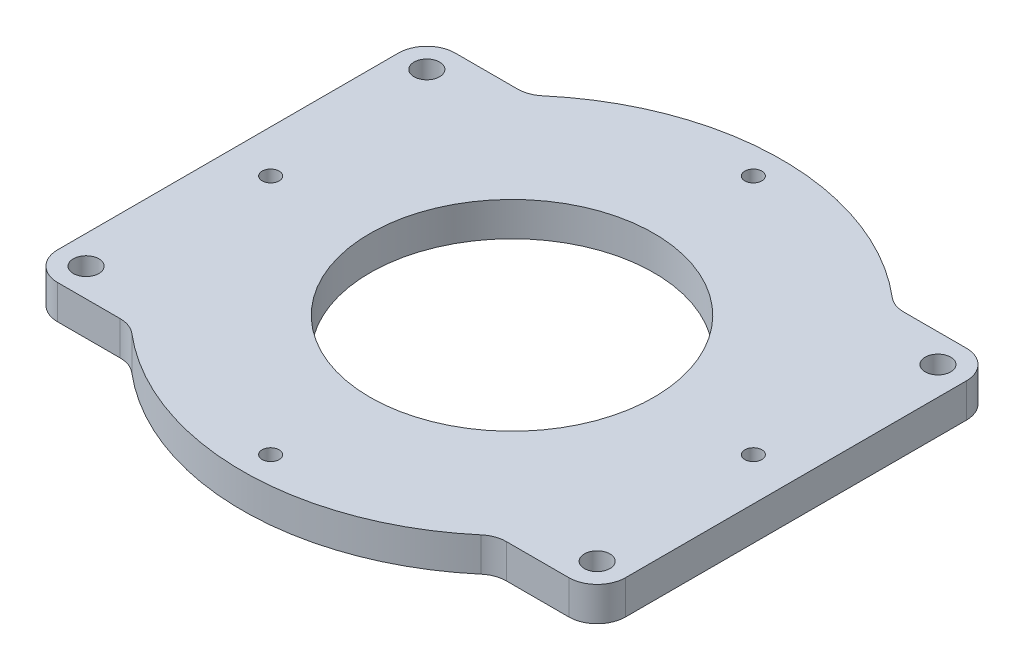
ISO-10303-21;
HEADER;
FILE_DESCRIPTION(('STEP AP214'),'2;1');
FILE_NAME('part.step','',(''),(''),'','','');
FILE_SCHEMA(('AUTOMOTIVE_DESIGN { 1 0 10303 214 1 1 1 1 }'));
ENDSEC;
DATA;
#1=APPLICATION_CONTEXT('core data for automotive mechanical design processes');
#2=APPLICATION_PROTOCOL_DEFINITION('international standard','automotive_design',2000,#1);
#3=PRODUCT_CONTEXT('',#1,'mechanical');
#4=PRODUCT('Part','Part','',(#3));
#5=PRODUCT_RELATED_PRODUCT_CATEGORY('part','',(#4));
#6=PRODUCT_DEFINITION_FORMATION('','',#4);
#7=PRODUCT_DEFINITION_CONTEXT('part definition',#1,'design');
#8=PRODUCT_DEFINITION('design','',#6,#7);
#9=PRODUCT_DEFINITION_SHAPE('','',#8);
#10=(LENGTH_UNIT() NAMED_UNIT(*) SI_UNIT(.MILLI.,.METRE.));
#11=(NAMED_UNIT(*) PLANE_ANGLE_UNIT() SI_UNIT($,.RADIAN.));
#12=(NAMED_UNIT(*) SI_UNIT($,.STERADIAN.) SOLID_ANGLE_UNIT());
#13=UNCERTAINTY_MEASURE_WITH_UNIT(LENGTH_MEASURE(1.E-05),#10,'distance_accuracy_value','');
#14=(GEOMETRIC_REPRESENTATION_CONTEXT(3) GLOBAL_UNCERTAINTY_ASSIGNED_CONTEXT((#13)) GLOBAL_UNIT_ASSIGNED_CONTEXT((#10,
#11,#12)) REPRESENTATION_CONTEXT('',''));
#15=CARTESIAN_POINT('',(0.,0.,0.));
#16=DIRECTION('',(0.,0.,1.));
#17=DIRECTION('',(1.,0.,0.));
#18=AXIS2_PLACEMENT_3D('',#15,#16,#17);
#19=CARTESIAN_POINT('',(-45.,6.,30.));
#20=DIRECTION('',(0.,1.,0.));
#21=DIRECTION('',(0.,0.,1.));
#22=AXIS2_PLACEMENT_3D('',#19,#20,#21);
#23=PLANE('',#22);
#24=CARTESIAN_POINT('',(0.,6.,42.5));
#25=DIRECTION('',(0.,1.,0.));
#26=DIRECTION('',(0.,0.,-1.));
#27=AXIS2_PLACEMENT_3D('',#24,#25,#26);
#28=CIRCLE('',#27,1.5);
#29=CARTESIAN_POINT('',(0.,6.,41.));
#30=VERTEX_POINT('',#29);
#31=EDGE_CURVE('E371',#30,#30,#28,.T.);
#32=ORIENTED_EDGE('',*,*,#31,.F.);
#33=EDGE_LOOP('',(#32));
#34=FACE_BOUND('',#33,.T.);
#35=CARTESIAN_POINT('',(0.,6.,-42.5));
#36=DIRECTION('',(0.,1.,0.));
#37=DIRECTION('',(0.,0.,1.));
#38=AXIS2_PLACEMENT_3D('',#35,#36,#37);
#39=CIRCLE('',#38,1.5);
#40=CARTESIAN_POINT('',(0.,6.,-41.));
#41=VERTEX_POINT('',#40);
#42=EDGE_CURVE('E383',#41,#41,#39,.T.);
#43=ORIENTED_EDGE('',*,*,#42,.F.);
#44=EDGE_LOOP('',(#43));
#45=FACE_BOUND('',#44,.T.);
#46=CARTESIAN_POINT('',(45.,6.,-30.));
#47=DIRECTION('',(0.,1.,0.));
#48=DIRECTION('',(0.,0.,1.));
#49=AXIS2_PLACEMENT_3D('',#46,#47,#48);
#50=CIRCLE('',#49,2.25);
#51=CARTESIAN_POINT('',(45.,6.,-27.75));
#52=VERTEX_POINT('',#51);
#53=EDGE_CURVE('E395',#52,#52,#50,.T.);
#54=ORIENTED_EDGE('',*,*,#53,.F.);
#55=EDGE_LOOP('',(#54));
#56=FACE_BOUND('',#55,.T.);
#57=CARTESIAN_POINT('',(-45.,6.,30.));
#58=DIRECTION('',(0.,1.,0.));
#59=DIRECTION('',(0.,0.,1.));
#60=AXIS2_PLACEMENT_3D('',#57,#58,#59);
#61=CIRCLE('',#60,2.25);
#62=CARTESIAN_POINT('',(-45.,6.,32.25));
#63=VERTEX_POINT('',#62);
#64=EDGE_CURVE('E407',#63,#63,#61,.T.);
#65=ORIENTED_EDGE('',*,*,#64,.F.);
#66=EDGE_LOOP('',(#65));
#67=FACE_BOUND('',#66,.T.);
#68=CARTESIAN_POINT('',(-45.,6.,30.));
#69=DIRECTION('',(0.,1.,0.));
#70=DIRECTION('',(0.,0.,1.));
#71=AXIS2_PLACEMENT_3D('',#68,#69,#70);
#72=CIRCLE('',#71,5.);
#73=CARTESIAN_POINT('',(-50.,6.,30.));
#74=VERTEX_POINT('',#73);
#75=CARTESIAN_POINT('',(-45.,6.,35.));
#76=VERTEX_POINT('',#75);
#77=EDGE_CURVE('E217',#74,#76,#72,.T.);
#78=ORIENTED_EDGE('',*,*,#77,.T.);
#79=DIRECTION('',(1.,0.,0.));
#80=VECTOR('',#79,1.);
#81=CARTESIAN_POINT('',(-45.,6.,35.));
#82=LINE('',#81,#80);
#83=CARTESIAN_POINT('',(-34.0036762718386,6.,35.));
#84=VERTEX_POINT('',#83);
#85=EDGE_CURVE('E125',#76,#84,#82,.T.);
#86=ORIENTED_EDGE('',*,*,#85,.T.);
#87=CARTESIAN_POINT('',(-34.0036762718386,6.,40.));
#88=DIRECTION('',(0.,-1.,0.));
#89=DIRECTION('',(0.,0.,1.));
#90=AXIS2_PLACEMENT_3D('',#87,#88,#89);
#91=CIRCLE('',#90,5.);
#92=CARTESIAN_POINT('',(-30.7652309126159,6.,36.1904761904762));
#93=VERTEX_POINT('',#92);
#94=EDGE_CURVE('E256',#84,#93,#91,.T.);
#95=ORIENTED_EDGE('',*,*,#94,.T.);
#96=CARTESIAN_POINT('',(0.,6.,0.));
#97=DIRECTION('',(0.,1.,0.));
#98=DIRECTION('',(0.,0.,-1.));
#99=AXIS2_PLACEMENT_3D('',#96,#97,#98);
#100=CIRCLE('',#99,47.5);
#101=CARTESIAN_POINT('',(30.7652309126159,6.,36.1904761904762));
#102=VERTEX_POINT('',#101);
#103=EDGE_CURVE('E275',#93,#102,#100,.T.);
#104=ORIENTED_EDGE('',*,*,#103,.T.);
#105=CARTESIAN_POINT('',(34.0036762718386,6.,40.));
#106=DIRECTION('',(0.,-1.,0.));
#107=DIRECTION('',(0.,0.,1.));
#108=AXIS2_PLACEMENT_3D('',#105,#106,#107);
#109=CIRCLE('',#108,5.);
#110=CARTESIAN_POINT('',(34.0036762718386,6.,35.));
#111=VERTEX_POINT('',#110);
#112=EDGE_CURVE('E272',#102,#111,#109,.T.);
#113=ORIENTED_EDGE('',*,*,#112,.T.);
#114=DIRECTION('',(1.,0.,0.));
#115=VECTOR('',#114,1.);
#116=CARTESIAN_POINT('',(34.0036762718386,6.,35.));
#117=LINE('',#116,#115);
#118=CARTESIAN_POINT('',(45.,6.,35.));
#119=VERTEX_POINT('',#118);
#120=EDGE_CURVE('E274',#111,#119,#117,.T.);
#121=ORIENTED_EDGE('',*,*,#120,.T.);
#122=CARTESIAN_POINT('',(45.,6.,30.));
#123=DIRECTION('',(0.,1.,0.));
#124=DIRECTION('',(0.,0.,1.));
#125=AXIS2_PLACEMENT_3D('',#122,#123,#124);
#126=CIRCLE('',#125,5.);
#127=CARTESIAN_POINT('',(50.,6.,30.));
#128=VERTEX_POINT('',#127);
#129=EDGE_CURVE('E277',#119,#128,#126,.T.);
#130=ORIENTED_EDGE('',*,*,#129,.T.);
#131=DIRECTION('',(0.,0.,-1.));
#132=VECTOR('',#131,1.);
#133=CARTESIAN_POINT('',(50.,6.,30.));
#134=LINE('',#133,#132);
#135=CARTESIAN_POINT('',(50.,6.,-30.));
#136=VERTEX_POINT('',#135);
#137=EDGE_CURVE('E283',#128,#136,#134,.T.);
#138=ORIENTED_EDGE('',*,*,#137,.T.);
#139=CARTESIAN_POINT('',(45.,6.,-30.));
#140=DIRECTION('',(0.,1.,0.));
#141=DIRECTION('',(0.,0.,1.));
#142=AXIS2_PLACEMENT_3D('',#139,#140,#141);
#143=CIRCLE('',#142,5.);
#144=CARTESIAN_POINT('',(45.,6.,-35.));
#145=VERTEX_POINT('',#144);
#146=EDGE_CURVE('E285',#136,#145,#143,.T.);
#147=ORIENTED_EDGE('',*,*,#146,.T.);
#148=DIRECTION('',(-1.,0.,0.));
#149=VECTOR('',#148,1.);
#150=CARTESIAN_POINT('',(34.0036762718386,6.,-35.));
#151=LINE('',#150,#149);
#152=CARTESIAN_POINT('',(34.0036762718386,6.,-35.));
#153=VERTEX_POINT('',#152);
#154=EDGE_CURVE('E287',#145,#153,#151,.T.);
#155=ORIENTED_EDGE('',*,*,#154,.T.);
#156=CARTESIAN_POINT('',(34.0036762718386,6.,-40.));
#157=DIRECTION('',(0.,-1.,0.));
#158=DIRECTION('',(0.,0.,-1.));
#159=AXIS2_PLACEMENT_3D('',#156,#157,#158);
#160=CIRCLE('',#159,5.);
#161=CARTESIAN_POINT('',(30.7652309126159,6.,-36.1904761904762));
#162=VERTEX_POINT('',#161);
#163=EDGE_CURVE('E289',#153,#162,#160,.T.);
#164=ORIENTED_EDGE('',*,*,#163,.T.);
#165=CARTESIAN_POINT('',(0.,6.,0.));
#166=DIRECTION('',(0.,1.,0.));
#167=DIRECTION('',(0.,0.,1.));
#168=AXIS2_PLACEMENT_3D('',#165,#166,#167);
#169=CIRCLE('',#168,47.5);
#170=CARTESIAN_POINT('',(-30.7652309126159,6.,-36.1904761904762));
#171=VERTEX_POINT('',#170);
#172=EDGE_CURVE('E291',#162,#171,#169,.T.);
#173=ORIENTED_EDGE('',*,*,#172,.T.);
#174=CARTESIAN_POINT('',(-34.0036762718386,6.,-40.));
#175=DIRECTION('',(0.,-1.,0.));
#176=DIRECTION('',(0.,0.,-1.));
#177=AXIS2_PLACEMENT_3D('',#174,#175,#176);
#178=CIRCLE('',#177,5.);
#179=CARTESIAN_POINT('',(-34.0036762718386,6.,-35.));
#180=VERTEX_POINT('',#179);
#181=EDGE_CURVE('E168',#171,#180,#178,.T.);
#182=ORIENTED_EDGE('',*,*,#181,.T.);
#183=DIRECTION('',(-1.,0.,0.));
#184=VECTOR('',#183,1.);
#185=CARTESIAN_POINT('',(-45.,6.,-35.));
#186=LINE('',#185,#184);
#187=CARTESIAN_POINT('',(-45.,6.,-35.));
#188=VERTEX_POINT('',#187);
#189=EDGE_CURVE('E162',#180,#188,#186,.T.);
#190=ORIENTED_EDGE('',*,*,#189,.T.);
#191=CARTESIAN_POINT('',(-45.,6.,-30.));
#192=DIRECTION('',(0.,1.,0.));
#193=DIRECTION('',(0.,0.,1.));
#194=AXIS2_PLACEMENT_3D('',#191,#192,#193);
#195=CIRCLE('',#194,5.);
#196=CARTESIAN_POINT('',(-50.,6.,-30.));
#197=VERTEX_POINT('',#196);
#198=EDGE_CURVE('E166',#188,#197,#195,.T.);
#199=ORIENTED_EDGE('',*,*,#198,.T.);
#200=DIRECTION('',(0.,0.,1.));
#201=VECTOR('',#200,1.);
#202=CARTESIAN_POINT('',(-50.,6.,30.));
#203=LINE('',#202,#201);
#204=EDGE_CURVE('E58',#197,#74,#203,.T.);
#205=ORIENTED_EDGE('',*,*,#204,.T.);
#206=EDGE_LOOP('',(#78,#86,#95,#104,#113,#121,#130,#138,#147,#155,#164,#173,#182,#190,#199,#205));
#207=FACE_BOUND('',#206,.T.);
#208=CARTESIAN_POINT('',(-45.,6.,-30.));
#209=DIRECTION('',(0.,1.,0.));
#210=DIRECTION('',(0.,0.,1.));
#211=AXIS2_PLACEMENT_3D('',#208,#209,#210);
#212=CIRCLE('',#211,2.25);
#213=CARTESIAN_POINT('',(-45.,6.,-27.75));
#214=VERTEX_POINT('',#213);
#215=EDGE_CURVE('E190',#214,#214,#212,.T.);
#216=ORIENTED_EDGE('',*,*,#215,.F.);
#217=EDGE_LOOP('',(#216));
#218=FACE_BOUND('',#217,.T.);
#219=CARTESIAN_POINT('',(45.,6.,30.));
#220=DIRECTION('',(0.,1.,0.));
#221=DIRECTION('',(0.,0.,1.));
#222=AXIS2_PLACEMENT_3D('',#219,#220,#221);
#223=CIRCLE('',#222,2.25000000000002);
#224=CARTESIAN_POINT('',(45.,6.,32.25));
#225=VERTEX_POINT('',#224);
#226=EDGE_CURVE('E401',#225,#225,#223,.T.);
#227=ORIENTED_EDGE('',*,*,#226,.F.);
#228=EDGE_LOOP('',(#227));
#229=FACE_BOUND('',#228,.T.);
#230=CARTESIAN_POINT('',(0.,6.,0.));
#231=DIRECTION('',(0.,1.,0.));
#232=DIRECTION('',(0.,0.,1.));
#233=AXIS2_PLACEMENT_3D('',#230,#231,#232);
#234=CIRCLE('',#233,25.);
#235=CARTESIAN_POINT('',(0.,6.,25.));
#236=VERTEX_POINT('',#235);
#237=EDGE_CURVE('E389',#236,#236,#234,.T.);
#238=ORIENTED_EDGE('',*,*,#237,.F.);
#239=EDGE_LOOP('',(#238));
#240=FACE_BOUND('',#239,.T.);
#241=CARTESIAN_POINT('',(42.5,6.,0.));
#242=DIRECTION('',(0.,1.,0.));
#243=DIRECTION('',(0.,0.,1.));
#244=AXIS2_PLACEMENT_3D('',#241,#242,#243);
#245=CIRCLE('',#244,1.5);
#246=CARTESIAN_POINT('',(42.5,6.,1.5));
#247=VERTEX_POINT('',#246);
#248=EDGE_CURVE('E377',#247,#247,#245,.T.);
#249=ORIENTED_EDGE('',*,*,#248,.F.);
#250=EDGE_LOOP('',(#249));
#251=FACE_BOUND('',#250,.T.);
#252=CARTESIAN_POINT('',(-42.5,6.,0.));
#253=DIRECTION('',(0.,1.,0.));
#254=DIRECTION('',(0.,0.,-1.));
#255=AXIS2_PLACEMENT_3D('',#252,#253,#254);
#256=CIRCLE('',#255,1.5);
#257=CARTESIAN_POINT('',(-42.5,6.,-1.50000000000001));
#258=VERTEX_POINT('',#257);
#259=EDGE_CURVE('E362',#258,#258,#256,.T.);
#260=ORIENTED_EDGE('',*,*,#259,.F.);
#261=EDGE_LOOP('',(#260));
#262=FACE_BOUND('',#261,.T.);
#263=ADVANCED_FACE('F41',(#34,#45,#56,#67,#207,#218,#229,#240,#251,#262),#23,.T.);
#264=CARTESIAN_POINT('',(-45.,0.,30.));
#265=DIRECTION('',(0.,1.,0.));
#266=DIRECTION('',(0.,0.,1.));
#267=AXIS2_PLACEMENT_3D('',#264,#265,#266);
#268=PLANE('',#267);
#269=CARTESIAN_POINT('',(-45.,0.,30.));
#270=DIRECTION('',(0.,1.,0.));
#271=DIRECTION('',(0.,0.,1.));
#272=AXIS2_PLACEMENT_3D('',#269,#270,#271);
#273=CIRCLE('',#272,5.);
#274=CARTESIAN_POINT('',(-50.,0.,30.));
#275=VERTEX_POINT('',#274);
#276=CARTESIAN_POINT('',(-45.,0.,35.));
#277=VERTEX_POINT('',#276);
#278=EDGE_CURVE('E186',#275,#277,#273,.T.);
#279=ORIENTED_EDGE('',*,*,#278,.F.);
#280=DIRECTION('',(0.,0.,1.));
#281=VECTOR('',#280,1.);
#282=CARTESIAN_POINT('',(-50.,0.,30.));
#283=LINE('',#282,#281);
#284=CARTESIAN_POINT('',(-50.,0.,-30.));
#285=VERTEX_POINT('',#284);
#286=EDGE_CURVE('E117',#285,#275,#283,.T.);
#287=ORIENTED_EDGE('',*,*,#286,.F.);
#288=CARTESIAN_POINT('',(-45.,0.,-30.));
#289=DIRECTION('',(0.,1.,0.));
#290=DIRECTION('',(0.,0.,1.));
#291=AXIS2_PLACEMENT_3D('',#288,#289,#290);
#292=CIRCLE('',#291,5.);
#293=CARTESIAN_POINT('',(-45.,0.,-35.));
#294=VERTEX_POINT('',#293);
#295=EDGE_CURVE('E111',#294,#285,#292,.T.);
#296=ORIENTED_EDGE('',*,*,#295,.F.);
#297=DIRECTION('',(-1.,0.,0.));
#298=VECTOR('',#297,1.);
#299=CARTESIAN_POINT('',(-45.,0.,-35.));
#300=LINE('',#299,#298);
#301=CARTESIAN_POINT('',(-34.0036762718386,0.,-35.));
#302=VERTEX_POINT('',#301);
#303=EDGE_CURVE('E176',#302,#294,#300,.T.);
#304=ORIENTED_EDGE('',*,*,#303,.F.);
#305=CARTESIAN_POINT('',(-34.0036762718386,0.,-40.));
#306=DIRECTION('',(0.,-1.,0.));
#307=DIRECTION('',(0.,0.,-1.));
#308=AXIS2_PLACEMENT_3D('',#305,#306,#307);
#309=CIRCLE('',#308,5.);
#310=CARTESIAN_POINT('',(-30.7652309126159,0.,-36.1904761904762));
#311=VERTEX_POINT('',#310);
#312=EDGE_CURVE('E212',#311,#302,#309,.T.);
#313=ORIENTED_EDGE('',*,*,#312,.F.);
#314=CARTESIAN_POINT('',(0.,0.,0.));
#315=DIRECTION('',(0.,1.,0.));
#316=DIRECTION('',(0.,0.,1.));
#317=AXIS2_PLACEMENT_3D('',#314,#315,#316);
#318=CIRCLE('',#317,47.5);
#319=CARTESIAN_POINT('',(30.7652309126159,0.,-36.1904761904762));
#320=VERTEX_POINT('',#319);
#321=EDGE_CURVE('E210',#320,#311,#318,.T.);
#322=ORIENTED_EDGE('',*,*,#321,.F.);
#323=CARTESIAN_POINT('',(34.0036762718386,0.,-40.));
#324=DIRECTION('',(0.,-1.,0.));
#325=DIRECTION('',(0.,0.,-1.));
#326=AXIS2_PLACEMENT_3D('',#323,#324,#325);
#327=CIRCLE('',#326,5.);
#328=CARTESIAN_POINT('',(34.0036762718386,0.,-35.));
#329=VERTEX_POINT('',#328);
#330=EDGE_CURVE('E208',#329,#320,#327,.T.);
#331=ORIENTED_EDGE('',*,*,#330,.F.);
#332=DIRECTION('',(-1.,0.,0.));
#333=VECTOR('',#332,1.);
#334=CARTESIAN_POINT('',(34.0036762718386,0.,-35.));
#335=LINE('',#334,#333);
#336=CARTESIAN_POINT('',(45.,0.,-35.));
#337=VERTEX_POINT('',#336);
#338=EDGE_CURVE('E206',#337,#329,#335,.T.);
#339=ORIENTED_EDGE('',*,*,#338,.F.);
#340=CARTESIAN_POINT('',(45.,0.,-30.));
#341=DIRECTION('',(0.,1.,0.));
#342=DIRECTION('',(0.,0.,1.));
#343=AXIS2_PLACEMENT_3D('',#340,#341,#342);
#344=CIRCLE('',#343,5.);
#345=CARTESIAN_POINT('',(50.,0.,-30.));
#346=VERTEX_POINT('',#345);
#347=EDGE_CURVE('E204',#346,#337,#344,.T.);
#348=ORIENTED_EDGE('',*,*,#347,.F.);
#349=DIRECTION('',(0.,0.,-1.));
#350=VECTOR('',#349,1.);
#351=CARTESIAN_POINT('',(50.,0.,30.));
#352=LINE('',#351,#350);
#353=CARTESIAN_POINT('',(50.,0.,30.));
#354=VERTEX_POINT('',#353);
#355=EDGE_CURVE('E202',#354,#346,#352,.T.);
#356=ORIENTED_EDGE('',*,*,#355,.F.);
#357=CARTESIAN_POINT('',(45.,0.,30.));
#358=DIRECTION('',(0.,1.,0.));
#359=DIRECTION('',(0.,0.,1.));
#360=AXIS2_PLACEMENT_3D('',#357,#358,#359);
#361=CIRCLE('',#360,5.);
#362=CARTESIAN_POINT('',(45.,0.,35.));
#363=VERTEX_POINT('',#362);
#364=EDGE_CURVE('E200',#363,#354,#361,.T.);
#365=ORIENTED_EDGE('',*,*,#364,.F.);
#366=DIRECTION('',(1.,0.,0.));
#367=VECTOR('',#366,1.);
#368=CARTESIAN_POINT('',(34.0036762718386,0.,35.));
#369=LINE('',#368,#367);
#370=CARTESIAN_POINT('',(34.0036762718386,0.,35.));
#371=VERTEX_POINT('',#370);
#372=EDGE_CURVE('E198',#371,#363,#369,.T.);
#373=ORIENTED_EDGE('',*,*,#372,.F.);
#374=CARTESIAN_POINT('',(34.0036762718386,0.,40.));
#375=DIRECTION('',(0.,-1.,0.));
#376=DIRECTION('',(0.,0.,1.));
#377=AXIS2_PLACEMENT_3D('',#374,#375,#376);
#378=CIRCLE('',#377,5.);
#379=CARTESIAN_POINT('',(30.7652309126159,0.,36.1904761904762));
#380=VERTEX_POINT('',#379);
#381=EDGE_CURVE('E196',#380,#371,#378,.T.);
#382=ORIENTED_EDGE('',*,*,#381,.F.);
#383=CARTESIAN_POINT('',(0.,0.,0.));
#384=DIRECTION('',(0.,1.,0.));
#385=DIRECTION('',(0.,0.,-1.));
#386=AXIS2_PLACEMENT_3D('',#383,#384,#385);
#387=CIRCLE('',#386,47.5);
#388=CARTESIAN_POINT('',(-30.7652309126159,0.,36.1904761904762));
#389=VERTEX_POINT('',#388);
#390=EDGE_CURVE('E194',#389,#380,#387,.T.);
#391=ORIENTED_EDGE('',*,*,#390,.F.);
#392=CARTESIAN_POINT('',(-34.0036762718386,0.,40.));
#393=DIRECTION('',(0.,-1.,0.));
#394=DIRECTION('',(0.,0.,1.));
#395=AXIS2_PLACEMENT_3D('',#392,#393,#394);
#396=CIRCLE('',#395,5.);
#397=CARTESIAN_POINT('',(-34.0036762718386,0.,35.));
#398=VERTEX_POINT('',#397);
#399=EDGE_CURVE('E192',#398,#389,#396,.T.);
#400=ORIENTED_EDGE('',*,*,#399,.F.);
#401=DIRECTION('',(1.,0.,0.));
#402=VECTOR('',#401,1.);
#403=CARTESIAN_POINT('',(-45.,0.,35.));
#404=LINE('',#403,#402);
#405=EDGE_CURVE('E189',#277,#398,#404,.T.);
#406=ORIENTED_EDGE('',*,*,#405,.F.);
#407=EDGE_LOOP('',(#279,#287,#296,#304,#313,#322,#331,#339,#348,#356,#365,#373,#382,#391,#400,#406));
#408=FACE_BOUND('',#407,.T.);
#409=CARTESIAN_POINT('',(-45.,0.,-30.));
#410=DIRECTION('',(0.,1.,0.));
#411=DIRECTION('',(0.,0.,1.));
#412=AXIS2_PLACEMENT_3D('',#409,#410,#411);
#413=CIRCLE('',#412,2.25);
#414=CARTESIAN_POINT('',(-45.,0.,-27.75));
#415=VERTEX_POINT('',#414);
#416=EDGE_CURVE('E410',#415,#415,#413,.T.);
#417=ORIENTED_EDGE('',*,*,#416,.T.);
#418=EDGE_LOOP('',(#417));
#419=FACE_BOUND('',#418,.T.);
#420=CARTESIAN_POINT('',(-45.,0.,30.));
#421=DIRECTION('',(0.,1.,0.));
#422=DIRECTION('',(0.,0.,1.));
#423=AXIS2_PLACEMENT_3D('',#420,#421,#422);
#424=CIRCLE('',#423,2.25);
#425=CARTESIAN_POINT('',(-45.,0.,32.25));
#426=VERTEX_POINT('',#425);
#427=EDGE_CURVE('E404',#426,#426,#424,.T.);
#428=ORIENTED_EDGE('',*,*,#427,.T.);
#429=EDGE_LOOP('',(#428));
#430=FACE_BOUND('',#429,.T.);
#431=CARTESIAN_POINT('',(45.,0.,30.));
#432=DIRECTION('',(0.,1.,0.));
#433=DIRECTION('',(0.,0.,1.));
#434=AXIS2_PLACEMENT_3D('',#431,#432,#433);
#435=CIRCLE('',#434,2.25000000000002);
#436=CARTESIAN_POINT('',(45.,0.,32.25));
#437=VERTEX_POINT('',#436);
#438=EDGE_CURVE('E398',#437,#437,#435,.T.);
#439=ORIENTED_EDGE('',*,*,#438,.T.);
#440=EDGE_LOOP('',(#439));
#441=FACE_BOUND('',#440,.T.);
#442=CARTESIAN_POINT('',(45.,0.,-30.));
#443=DIRECTION('',(0.,1.,0.));
#444=DIRECTION('',(0.,0.,1.));
#445=AXIS2_PLACEMENT_3D('',#442,#443,#444);
#446=CIRCLE('',#445,2.25);
#447=CARTESIAN_POINT('',(45.,0.,-27.75));
#448=VERTEX_POINT('',#447);
#449=EDGE_CURVE('E392',#448,#448,#446,.T.);
#450=ORIENTED_EDGE('',*,*,#449,.T.);
#451=EDGE_LOOP('',(#450));
#452=FACE_BOUND('',#451,.T.);
#453=CARTESIAN_POINT('',(0.,0.,0.));
#454=DIRECTION('',(0.,1.,0.));
#455=DIRECTION('',(0.,0.,1.));
#456=AXIS2_PLACEMENT_3D('',#453,#454,#455);
#457=CIRCLE('',#456,25.);
#458=CARTESIAN_POINT('',(0.,0.,25.));
#459=VERTEX_POINT('',#458);
#460=EDGE_CURVE('E386',#459,#459,#457,.T.);
#461=ORIENTED_EDGE('',*,*,#460,.T.);
#462=EDGE_LOOP('',(#461));
#463=FACE_BOUND('',#462,.T.);
#464=CARTESIAN_POINT('',(0.,0.,-42.5));
#465=DIRECTION('',(0.,1.,0.));
#466=DIRECTION('',(0.,0.,1.));
#467=AXIS2_PLACEMENT_3D('',#464,#465,#466);
#468=CIRCLE('',#467,1.5);
#469=CARTESIAN_POINT('',(0.,0.,-41.));
#470=VERTEX_POINT('',#469);
#471=EDGE_CURVE('E380',#470,#470,#468,.T.);
#472=ORIENTED_EDGE('',*,*,#471,.T.);
#473=EDGE_LOOP('',(#472));
#474=FACE_BOUND('',#473,.T.);
#475=CARTESIAN_POINT('',(42.5,0.,0.));
#476=DIRECTION('',(0.,1.,0.));
#477=DIRECTION('',(0.,0.,1.));
#478=AXIS2_PLACEMENT_3D('',#475,#476,#477);
#479=CIRCLE('',#478,1.5);
#480=CARTESIAN_POINT('',(42.5,0.,1.5));
#481=VERTEX_POINT('',#480);
#482=EDGE_CURVE('E374',#481,#481,#479,.T.);
#483=ORIENTED_EDGE('',*,*,#482,.T.);
#484=EDGE_LOOP('',(#483));
#485=FACE_BOUND('',#484,.T.);
#486=CARTESIAN_POINT('',(0.,0.,42.5));
#487=DIRECTION('',(0.,1.,0.));
#488=DIRECTION('',(0.,0.,-1.));
#489=AXIS2_PLACEMENT_3D('',#486,#487,#488);
#490=CIRCLE('',#489,1.5);
#491=CARTESIAN_POINT('',(0.,0.,41.));
#492=VERTEX_POINT('',#491);
#493=EDGE_CURVE('E368',#492,#492,#490,.T.);
#494=ORIENTED_EDGE('',*,*,#493,.T.);
#495=EDGE_LOOP('',(#494));
#496=FACE_BOUND('',#495,.T.);
#497=CARTESIAN_POINT('',(-42.5,0.,0.));
#498=DIRECTION('',(0.,1.,0.));
#499=DIRECTION('',(0.,0.,-1.));
#500=AXIS2_PLACEMENT_3D('',#497,#498,#499);
#501=CIRCLE('',#500,1.5);
#502=CARTESIAN_POINT('',(-42.5,0.,-1.50000000000001));
#503=VERTEX_POINT('',#502);
#504=EDGE_CURVE('E365',#503,#503,#501,.T.);
#505=ORIENTED_EDGE('',*,*,#504,.T.);
#506=EDGE_LOOP('',(#505));
#507=FACE_BOUND('',#506,.T.);
#508=ADVANCED_FACE('F260',(#408,#419,#430,#441,#452,#463,#474,#485,#496,#507),#268,.F.);
#509=CARTESIAN_POINT('',(-45.,6.,30.));
#510=DIRECTION('',(0.,-1.,0.));
#511=DIRECTION('',(0.,0.,-1.));
#512=AXIS2_PLACEMENT_3D('',#509,#510,#511);
#513=CYLINDRICAL_SURFACE('',#512,5.);
#514=ORIENTED_EDGE('',*,*,#278,.T.);
#515=DIRECTION('',(0.,-1.,0.));
#516=VECTOR('',#515,1.);
#517=CARTESIAN_POINT('',(-45.,6.,35.));
#518=LINE('',#517,#516);
#519=EDGE_CURVE('E11',#76,#277,#518,.T.);
#520=ORIENTED_EDGE('',*,*,#519,.F.);
#521=ORIENTED_EDGE('',*,*,#77,.F.);
#522=DIRECTION('',(0.,-1.,0.));
#523=VECTOR('',#522,1.);
#524=CARTESIAN_POINT('',(-50.,6.,30.));
#525=LINE('',#524,#523);
#526=EDGE_CURVE('E182',#74,#275,#525,.T.);
#527=ORIENTED_EDGE('',*,*,#526,.T.);
#528=EDGE_LOOP('',(#514,#520,#521,#527));
#529=FACE_BOUND('',#528,.T.);
#530=ADVANCED_FACE('F43',(#529),#513,.T.);
#531=CARTESIAN_POINT('',(-45.,6.,35.));
#532=DIRECTION('',(0.,0.,-1.));
#533=DIRECTION('',(-1.,0.,0.));
#534=AXIS2_PLACEMENT_3D('',#531,#532,#533);
#535=PLANE('',#534);
#536=ORIENTED_EDGE('',*,*,#405,.T.);
#537=DIRECTION('',(0.,-1.,0.));
#538=VECTOR('',#537,1.);
#539=CARTESIAN_POINT('',(-34.0036762718386,6.,35.));
#540=LINE('',#539,#538);
#541=EDGE_CURVE('E50',#84,#398,#540,.T.);
#542=ORIENTED_EDGE('',*,*,#541,.F.);
#543=ORIENTED_EDGE('',*,*,#85,.F.);
#544=ORIENTED_EDGE('',*,*,#519,.T.);
#545=EDGE_LOOP('',(#536,#542,#543,#544));
#546=FACE_BOUND('',#545,.T.);
#547=ADVANCED_FACE('F614',(#546),#535,.F.);
#548=CARTESIAN_POINT('',(-34.0036762718386,6.,40.));
#549=DIRECTION('',(0.,-1.,0.));
#550=DIRECTION('',(0.,0.,-1.));
#551=AXIS2_PLACEMENT_3D('',#548,#549,#550);
#552=CYLINDRICAL_SURFACE('',#551,5.);
#553=ORIENTED_EDGE('',*,*,#399,.T.);
#554=DIRECTION('',(0.,-1.,0.));
#555=VECTOR('',#554,1.);
#556=CARTESIAN_POINT('',(-30.7652309126159,6.,36.1904761904762));
#557=LINE('',#556,#555);
#558=EDGE_CURVE('E248',#93,#389,#557,.T.);
#559=ORIENTED_EDGE('',*,*,#558,.F.);
#560=ORIENTED_EDGE('',*,*,#94,.F.);
#561=ORIENTED_EDGE('',*,*,#541,.T.);
#562=EDGE_LOOP('',(#553,#559,#560,#561));
#563=FACE_BOUND('',#562,.T.);
#564=ADVANCED_FACE('F254',(#563),#552,.F.);
#565=CARTESIAN_POINT('',(0.,6.,0.));
#566=DIRECTION('',(0.,-1.,0.));
#567=DIRECTION('',(0.,0.,-1.));
#568=AXIS2_PLACEMENT_3D('',#565,#566,#567);
#569=CYLINDRICAL_SURFACE('',#568,47.5);
#570=ORIENTED_EDGE('',*,*,#390,.T.);
#571=DIRECTION('',(0.,-1.,0.));
#572=VECTOR('',#571,1.);
#573=CARTESIAN_POINT('',(30.7652309126159,6.,36.1904761904762));
#574=LINE('',#573,#572);
#575=EDGE_CURVE('E245',#102,#380,#574,.T.);
#576=ORIENTED_EDGE('',*,*,#575,.F.);
#577=ORIENTED_EDGE('',*,*,#103,.F.);
#578=ORIENTED_EDGE('',*,*,#558,.T.);
#579=EDGE_LOOP('',(#570,#576,#577,#578));
#580=FACE_BOUND('',#579,.T.);
#581=ADVANCED_FACE('F266',(#580),#569,.T.);
#582=CARTESIAN_POINT('',(34.0036762718386,6.,40.));
#583=DIRECTION('',(0.,-1.,0.));
#584=DIRECTION('',(0.,0.,-1.));
#585=AXIS2_PLACEMENT_3D('',#582,#583,#584);
#586=CYLINDRICAL_SURFACE('',#585,5.);
#587=ORIENTED_EDGE('',*,*,#381,.T.);
#588=DIRECTION('',(0.,-1.,0.));
#589=VECTOR('',#588,1.);
#590=CARTESIAN_POINT('',(34.0036762718386,6.,35.));
#591=LINE('',#590,#589);
#592=EDGE_CURVE('E242',#111,#371,#591,.T.);
#593=ORIENTED_EDGE('',*,*,#592,.F.);
#594=ORIENTED_EDGE('',*,*,#112,.F.);
#595=ORIENTED_EDGE('',*,*,#575,.T.);
#596=EDGE_LOOP('',(#587,#593,#594,#595));
#597=FACE_BOUND('',#596,.T.);
#598=ADVANCED_FACE('F270',(#597),#586,.F.);
#599=CARTESIAN_POINT('',(34.0036762718386,6.,35.));
#600=DIRECTION('',(0.,0.,-1.));
#601=DIRECTION('',(-1.,0.,0.));
#602=AXIS2_PLACEMENT_3D('',#599,#600,#601);
#603=PLANE('',#602);
#604=ORIENTED_EDGE('',*,*,#372,.T.);
#605=DIRECTION('',(0.,-1.,0.));
#606=VECTOR('',#605,1.);
#607=CARTESIAN_POINT('',(45.,6.,35.));
#608=LINE('',#607,#606);
#609=EDGE_CURVE('E239',#119,#363,#608,.T.);
#610=ORIENTED_EDGE('',*,*,#609,.F.);
#611=ORIENTED_EDGE('',*,*,#120,.F.);
#612=ORIENTED_EDGE('',*,*,#592,.T.);
#613=EDGE_LOOP('',(#604,#610,#611,#612));
#614=FACE_BOUND('',#613,.T.);
#615=ADVANCED_FACE('F579',(#614),#603,.F.);
#616=CARTESIAN_POINT('',(45.,6.,30.));
#617=DIRECTION('',(0.,-1.,0.));
#618=DIRECTION('',(0.,0.,-1.));
#619=AXIS2_PLACEMENT_3D('',#616,#617,#618);
#620=CYLINDRICAL_SURFACE('',#619,5.);
#621=ORIENTED_EDGE('',*,*,#364,.T.);
#622=DIRECTION('',(0.,-1.,0.));
#623=VECTOR('',#622,1.);
#624=CARTESIAN_POINT('',(50.,6.,30.));
#625=LINE('',#624,#623);
#626=EDGE_CURVE('E236',#128,#354,#625,.T.);
#627=ORIENTED_EDGE('',*,*,#626,.F.);
#628=ORIENTED_EDGE('',*,*,#129,.F.);
#629=ORIENTED_EDGE('',*,*,#609,.T.);
#630=EDGE_LOOP('',(#621,#627,#628,#629));
#631=FACE_BOUND('',#630,.T.);
#632=ADVANCED_FACE('F569',(#631),#620,.T.);
#633=CARTESIAN_POINT('',(50.,6.,30.));
#634=DIRECTION('',(-1.,0.,0.));
#635=DIRECTION('',(0.,0.,1.));
#636=AXIS2_PLACEMENT_3D('',#633,#634,#635);
#637=PLANE('',#636);
#638=ORIENTED_EDGE('',*,*,#355,.T.);
#639=DIRECTION('',(0.,-1.,0.));
#640=VECTOR('',#639,1.);
#641=CARTESIAN_POINT('',(50.,6.,-30.));
#642=LINE('',#641,#640);
#643=EDGE_CURVE('E233',#136,#346,#642,.T.);
#644=ORIENTED_EDGE('',*,*,#643,.F.);
#645=ORIENTED_EDGE('',*,*,#137,.F.);
#646=ORIENTED_EDGE('',*,*,#626,.T.);
#647=EDGE_LOOP('',(#638,#644,#645,#646));
#648=FACE_BOUND('',#647,.T.);
#649=ADVANCED_FACE('F559',(#648),#637,.F.);
#650=CARTESIAN_POINT('',(45.,6.,-30.));
#651=DIRECTION('',(0.,-1.,0.));
#652=DIRECTION('',(0.,0.,-1.));
#653=AXIS2_PLACEMENT_3D('',#650,#651,#652);
#654=CYLINDRICAL_SURFACE('',#653,5.);
#655=ORIENTED_EDGE('',*,*,#347,.T.);
#656=DIRECTION('',(0.,-1.,0.));
#657=VECTOR('',#656,1.);
#658=CARTESIAN_POINT('',(45.,6.,-35.));
#659=LINE('',#658,#657);
#660=EDGE_CURVE('E230',#145,#337,#659,.T.);
#661=ORIENTED_EDGE('',*,*,#660,.F.);
#662=ORIENTED_EDGE('',*,*,#146,.F.);
#663=ORIENTED_EDGE('',*,*,#643,.T.);
#664=EDGE_LOOP('',(#655,#661,#662,#663));
#665=FACE_BOUND('',#664,.T.);
#666=ADVANCED_FACE('F549',(#665),#654,.T.);
#667=CARTESIAN_POINT('',(34.0036762718386,6.,-35.));
#668=DIRECTION('',(0.,0.,1.));
#669=DIRECTION('',(1.,0.,0.));
#670=AXIS2_PLACEMENT_3D('',#667,#668,#669);
#671=PLANE('',#670);
#672=ORIENTED_EDGE('',*,*,#338,.T.);
#673=DIRECTION('',(0.,-1.,0.));
#674=VECTOR('',#673,1.);
#675=CARTESIAN_POINT('',(34.0036762718386,6.,-35.));
#676=LINE('',#675,#674);
#677=EDGE_CURVE('E227',#153,#329,#676,.T.);
#678=ORIENTED_EDGE('',*,*,#677,.F.);
#679=ORIENTED_EDGE('',*,*,#154,.F.);
#680=ORIENTED_EDGE('',*,*,#660,.T.);
#681=EDGE_LOOP('',(#672,#678,#679,#680));
#682=FACE_BOUND('',#681,.T.);
#683=ADVANCED_FACE('F539',(#682),#671,.F.);
#684=CARTESIAN_POINT('',(34.0036762718386,6.,-40.));
#685=DIRECTION('',(0.,-1.,0.));
#686=DIRECTION('',(0.,0.,-1.));
#687=AXIS2_PLACEMENT_3D('',#684,#685,#686);
#688=CYLINDRICAL_SURFACE('',#687,5.);
#689=ORIENTED_EDGE('',*,*,#330,.T.);
#690=DIRECTION('',(0.,-1.,0.));
#691=VECTOR('',#690,1.);
#692=CARTESIAN_POINT('',(30.7652309126159,6.,-36.1904761904762));
#693=LINE('',#692,#691);
#694=EDGE_CURVE('E224',#162,#320,#693,.T.);
#695=ORIENTED_EDGE('',*,*,#694,.F.);
#696=ORIENTED_EDGE('',*,*,#163,.F.);
#697=ORIENTED_EDGE('',*,*,#677,.T.);
#698=EDGE_LOOP('',(#689,#695,#696,#697));
#699=FACE_BOUND('',#698,.T.);
#700=ADVANCED_FACE('F530',(#699),#688,.F.);
#701=CARTESIAN_POINT('',(0.,6.,0.));
#702=DIRECTION('',(0.,-1.,0.));
#703=DIRECTION('',(0.,0.,-1.));
#704=AXIS2_PLACEMENT_3D('',#701,#702,#703);
#705=CYLINDRICAL_SURFACE('',#704,47.5);
#706=ORIENTED_EDGE('',*,*,#321,.T.);
#707=DIRECTION('',(0.,-1.,0.));
#708=VECTOR('',#707,1.);
#709=CARTESIAN_POINT('',(-30.7652309126159,6.,-36.1904761904762));
#710=LINE('',#709,#708);
#711=EDGE_CURVE('E221',#171,#311,#710,.T.);
#712=ORIENTED_EDGE('',*,*,#711,.F.);
#713=ORIENTED_EDGE('',*,*,#172,.F.);
#714=ORIENTED_EDGE('',*,*,#694,.T.);
#715=EDGE_LOOP('',(#706,#712,#713,#714));
#716=FACE_BOUND('',#715,.T.);
#717=ADVANCED_FACE('F297',(#716),#705,.T.);
#718=CARTESIAN_POINT('',(-34.0036762718386,6.,-40.));
#719=DIRECTION('',(0.,-1.,0.));
#720=DIRECTION('',(0.,0.,-1.));
#721=AXIS2_PLACEMENT_3D('',#718,#719,#720);
#722=CYLINDRICAL_SURFACE('',#721,5.);
#723=ORIENTED_EDGE('',*,*,#312,.T.);
#724=DIRECTION('',(0.,-1.,0.));
#725=VECTOR('',#724,1.);
#726=CARTESIAN_POINT('',(-34.0036762718386,6.,-35.));
#727=LINE('',#726,#725);
#728=EDGE_CURVE('E177',#180,#302,#727,.T.);
#729=ORIENTED_EDGE('',*,*,#728,.F.);
#730=ORIENTED_EDGE('',*,*,#181,.F.);
#731=ORIENTED_EDGE('',*,*,#711,.T.);
#732=EDGE_LOOP('',(#723,#729,#730,#731));
#733=FACE_BOUND('',#732,.T.);
#734=ADVANCED_FACE('F301',(#733),#722,.F.);
#735=CARTESIAN_POINT('',(-45.,6.,-35.));
#736=DIRECTION('',(0.,0.,1.));
#737=DIRECTION('',(1.,0.,0.));
#738=AXIS2_PLACEMENT_3D('',#735,#736,#737);
#739=PLANE('',#738);
#740=ORIENTED_EDGE('',*,*,#303,.T.);
#741=DIRECTION('',(0.,-1.,0.));
#742=VECTOR('',#741,1.);
#743=CARTESIAN_POINT('',(-45.,6.,-35.));
#744=LINE('',#743,#742);
#745=EDGE_CURVE('E173',#188,#294,#744,.T.);
#746=ORIENTED_EDGE('',*,*,#745,.F.);
#747=ORIENTED_EDGE('',*,*,#189,.F.);
#748=ORIENTED_EDGE('',*,*,#728,.T.);
#749=EDGE_LOOP('',(#740,#746,#747,#748));
#750=FACE_BOUND('',#749,.T.);
#751=ADVANCED_FACE('F174',(#750),#739,.F.);
#752=CARTESIAN_POINT('',(-45.,6.,-30.));
#753=DIRECTION('',(0.,-1.,0.));
#754=DIRECTION('',(0.,0.,-1.));
#755=AXIS2_PLACEMENT_3D('',#752,#753,#754);
#756=CYLINDRICAL_SURFACE('',#755,5.);
#757=ORIENTED_EDGE('',*,*,#295,.T.);
#758=DIRECTION('',(0.,-1.,0.));
#759=VECTOR('',#758,1.);
#760=CARTESIAN_POINT('',(-50.,6.,-30.));
#761=LINE('',#760,#759);
#762=EDGE_CURVE('E178',#197,#285,#761,.T.);
#763=ORIENTED_EDGE('',*,*,#762,.F.);
#764=ORIENTED_EDGE('',*,*,#198,.F.);
#765=ORIENTED_EDGE('',*,*,#745,.T.);
#766=EDGE_LOOP('',(#757,#763,#764,#765));
#767=FACE_BOUND('',#766,.T.);
#768=ADVANCED_FACE('F180',(#767),#756,.T.);
#769=CARTESIAN_POINT('',(-50.,6.,30.));
#770=DIRECTION('',(1.,0.,0.));
#771=DIRECTION('',(0.,0.,-1.));
#772=AXIS2_PLACEMENT_3D('',#769,#770,#771);
#773=PLANE('',#772);
#774=ORIENTED_EDGE('',*,*,#286,.T.);
#775=ORIENTED_EDGE('',*,*,#526,.F.);
#776=ORIENTED_EDGE('',*,*,#204,.F.);
#777=ORIENTED_EDGE('',*,*,#762,.T.);
#778=EDGE_LOOP('',(#774,#775,#776,#777));
#779=FACE_BOUND('',#778,.T.);
#780=ADVANCED_FACE('F305',(#779),#773,.F.);
#781=CARTESIAN_POINT('',(-45.,6.,-30.));
#782=DIRECTION('',(0.,-1.,0.));
#783=DIRECTION('',(0.,0.,-1.));
#784=AXIS2_PLACEMENT_3D('',#781,#782,#783);
#785=CYLINDRICAL_SURFACE('',#784,2.25);
#786=ORIENTED_EDGE('',*,*,#215,.T.);
#787=EDGE_LOOP('',(#786));
#788=FACE_BOUND('',#787,.T.);
#789=ORIENTED_EDGE('',*,*,#416,.F.);
#790=EDGE_LOOP('',(#789));
#791=FACE_BOUND('',#790,.T.);
#792=ADVANCED_FACE('F307',(#788,#791),#785,.F.);
#793=CARTESIAN_POINT('',(-45.,6.,30.));
#794=DIRECTION('',(0.,-1.,0.));
#795=DIRECTION('',(0.,0.,-1.));
#796=AXIS2_PLACEMENT_3D('',#793,#794,#795);
#797=CYLINDRICAL_SURFACE('',#796,2.25);
#798=ORIENTED_EDGE('',*,*,#64,.T.);
#799=EDGE_LOOP('',(#798));
#800=FACE_BOUND('',#799,.T.);
#801=ORIENTED_EDGE('',*,*,#427,.F.);
#802=EDGE_LOOP('',(#801));
#803=FACE_BOUND('',#802,.T.);
#804=ADVANCED_FACE('F313',(#800,#803),#797,.F.);
#805=CARTESIAN_POINT('',(45.,6.,30.));
#806=DIRECTION('',(0.,-1.,0.));
#807=DIRECTION('',(0.,0.,-1.));
#808=AXIS2_PLACEMENT_3D('',#805,#806,#807);
#809=CYLINDRICAL_SURFACE('',#808,2.25000000000002);
#810=ORIENTED_EDGE('',*,*,#226,.T.);
#811=EDGE_LOOP('',(#810));
#812=FACE_BOUND('',#811,.T.);
#813=ORIENTED_EDGE('',*,*,#438,.F.);
#814=EDGE_LOOP('',(#813));
#815=FACE_BOUND('',#814,.T.);
#816=ADVANCED_FACE('F329',(#812,#815),#809,.F.);
#817=CARTESIAN_POINT('',(45.,6.,-30.));
#818=DIRECTION('',(0.,-1.,0.));
#819=DIRECTION('',(0.,0.,-1.));
#820=AXIS2_PLACEMENT_3D('',#817,#818,#819);
#821=CYLINDRICAL_SURFACE('',#820,2.25);
#822=ORIENTED_EDGE('',*,*,#53,.T.);
#823=EDGE_LOOP('',(#822));
#824=FACE_BOUND('',#823,.T.);
#825=ORIENTED_EDGE('',*,*,#449,.F.);
#826=EDGE_LOOP('',(#825));
#827=FACE_BOUND('',#826,.T.);
#828=ADVANCED_FACE('F333',(#824,#827),#821,.F.);
#829=CARTESIAN_POINT('',(0.,6.,0.));
#830=DIRECTION('',(0.,-1.,0.));
#831=DIRECTION('',(0.,0.,-1.));
#832=AXIS2_PLACEMENT_3D('',#829,#830,#831);
#833=CYLINDRICAL_SURFACE('',#832,25.);
#834=ORIENTED_EDGE('',*,*,#237,.T.);
#835=EDGE_LOOP('',(#834));
#836=FACE_BOUND('',#835,.T.);
#837=ORIENTED_EDGE('',*,*,#460,.F.);
#838=EDGE_LOOP('',(#837));
#839=FACE_BOUND('',#838,.T.);
#840=ADVANCED_FACE('F337',(#836,#839),#833,.F.);
#841=CARTESIAN_POINT('',(0.,6.,-42.5));
#842=DIRECTION('',(0.,-1.,0.));
#843=DIRECTION('',(0.,0.,-1.));
#844=AXIS2_PLACEMENT_3D('',#841,#842,#843);
#845=CYLINDRICAL_SURFACE('',#844,1.5);
#846=ORIENTED_EDGE('',*,*,#42,.T.);
#847=EDGE_LOOP('',(#846));
#848=FACE_BOUND('',#847,.T.);
#849=ORIENTED_EDGE('',*,*,#471,.F.);
#850=EDGE_LOOP('',(#849));
#851=FACE_BOUND('',#850,.T.);
#852=ADVANCED_FACE('F341',(#848,#851),#845,.F.);
#853=CARTESIAN_POINT('',(42.5,6.,0.));
#854=DIRECTION('',(0.,-1.,0.));
#855=DIRECTION('',(0.,0.,-1.));
#856=AXIS2_PLACEMENT_3D('',#853,#854,#855);
#857=CYLINDRICAL_SURFACE('',#856,1.5);
#858=ORIENTED_EDGE('',*,*,#248,.T.);
#859=EDGE_LOOP('',(#858));
#860=FACE_BOUND('',#859,.T.);
#861=ORIENTED_EDGE('',*,*,#482,.F.);
#862=EDGE_LOOP('',(#861));
#863=FACE_BOUND('',#862,.T.);
#864=ADVANCED_FACE('F345',(#860,#863),#857,.F.);
#865=CARTESIAN_POINT('',(0.,6.,42.5));
#866=DIRECTION('',(0.,-1.,0.));
#867=DIRECTION('',(0.,0.,-1.));
#868=AXIS2_PLACEMENT_3D('',#865,#866,#867);
#869=CYLINDRICAL_SURFACE('',#868,1.5);
#870=ORIENTED_EDGE('',*,*,#31,.T.);
#871=EDGE_LOOP('',(#870));
#872=FACE_BOUND('',#871,.T.);
#873=ORIENTED_EDGE('',*,*,#493,.F.);
#874=EDGE_LOOP('',(#873));
#875=FACE_BOUND('',#874,.T.);
#876=ADVANCED_FACE('F349',(#872,#875),#869,.F.);
#877=CARTESIAN_POINT('',(-42.5,6.,0.));
#878=DIRECTION('',(0.,-1.,0.));
#879=DIRECTION('',(0.,0.,-1.));
#880=AXIS2_PLACEMENT_3D('',#877,#878,#879);
#881=CYLINDRICAL_SURFACE('',#880,1.5);
#882=ORIENTED_EDGE('',*,*,#259,.T.);
#883=EDGE_LOOP('',(#882));
#884=FACE_BOUND('',#883,.T.);
#885=ORIENTED_EDGE('',*,*,#504,.F.);
#886=EDGE_LOOP('',(#885));
#887=FACE_BOUND('',#886,.T.);
#888=ADVANCED_FACE('F353',(#884,#887),#881,.F.);
#889=CLOSED_SHELL('',(#263,#508,#530,#547,#564,#581,#598,#615,#632,#649,#666,#683,#700,#717,
#734,#751,#768,#780,#792,#804,#816,#828,#840,#852,#864,#876,#888));
#890=MANIFOLD_SOLID_BREP('B2',#889);
#891=ADVANCED_BREP_SHAPE_REPRESENTATION('',(#18,#890),#14);
#892=SHAPE_DEFINITION_REPRESENTATION(#9,#891);
ENDSEC;
END-ISO-10303-21;
